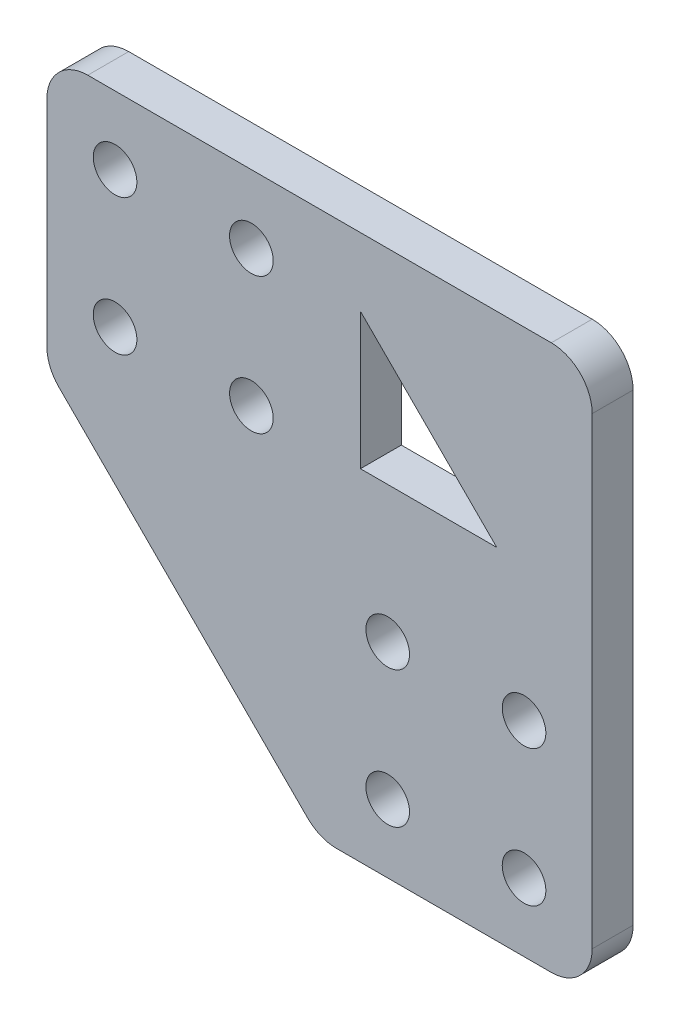
ISO-10303-21;
HEADER;
FILE_DESCRIPTION(('STEP AP214'),'2;1');
FILE_NAME('part.step','',(''),(''),'','','');
FILE_SCHEMA(('AUTOMOTIVE_DESIGN { 1 0 10303 214 1 1 1 1 }'));
ENDSEC;
DATA;
#1=APPLICATION_CONTEXT('core data for automotive mechanical design processes');
#2=APPLICATION_PROTOCOL_DEFINITION('international standard','automotive_design',2000,#1);
#3=PRODUCT_CONTEXT('',#1,'mechanical');
#4=PRODUCT('Part','Part','',(#3));
#5=PRODUCT_RELATED_PRODUCT_CATEGORY('part','',(#4));
#6=PRODUCT_DEFINITION_FORMATION('','',#4);
#7=PRODUCT_DEFINITION_CONTEXT('part definition',#1,'design');
#8=PRODUCT_DEFINITION('design','',#6,#7);
#9=PRODUCT_DEFINITION_SHAPE('','',#8);
#10=(LENGTH_UNIT() NAMED_UNIT(*) SI_UNIT(.MILLI.,.METRE.));
#11=(NAMED_UNIT(*) PLANE_ANGLE_UNIT() SI_UNIT($,.RADIAN.));
#12=(NAMED_UNIT(*) SI_UNIT($,.STERADIAN.) SOLID_ANGLE_UNIT());
#13=UNCERTAINTY_MEASURE_WITH_UNIT(LENGTH_MEASURE(1.E-05),#10,'distance_accuracy_value','');
#14=(GEOMETRIC_REPRESENTATION_CONTEXT(3) GLOBAL_UNCERTAINTY_ASSIGNED_CONTEXT((#13)) GLOBAL_UNIT_ASSIGNED_CONTEXT((#10,
#11,#12)) REPRESENTATION_CONTEXT('',''));
#15=CARTESIAN_POINT('',(0.,0.,0.));
#16=DIRECTION('',(0.,0.,1.));
#17=DIRECTION('',(1.,0.,0.));
#18=AXIS2_PLACEMENT_3D('',#15,#16,#17);
#19=CARTESIAN_POINT('',(0.,0.,3.));
#20=DIRECTION('',(0.,0.,-1.));
#21=DIRECTION('',(-1.,0.,0.));
#22=AXIS2_PLACEMENT_3D('',#19,#20,#21);
#23=PLANE('',#22);
#24=CARTESIAN_POINT('',(25.,-25.,3.));
#25=DIRECTION('',(0.,0.,1.));
#26=DIRECTION('',(-1.,0.,0.));
#27=AXIS2_PLACEMENT_3D('',#24,#25,#26);
#28=CIRCLE('',#27,1.6);
#29=CARTESIAN_POINT('',(23.4,-25.,3.));
#30=VERTEX_POINT('',#29);
#31=EDGE_CURVE('E182',#30,#30,#28,.T.);
#32=ORIENTED_EDGE('',*,*,#31,.F.);
#33=EDGE_LOOP('',(#32));
#34=FACE_BOUND('',#33,.T.);
#35=CARTESIAN_POINT('',(35.,-25.,3.));
#36=DIRECTION('',(0.,0.,1.));
#37=DIRECTION('',(1.,0.,0.));
#38=AXIS2_PLACEMENT_3D('',#35,#36,#37);
#39=CIRCLE('',#38,1.6);
#40=CARTESIAN_POINT('',(36.6,-25.,3.));
#41=VERTEX_POINT('',#40);
#42=EDGE_CURVE('E190',#41,#41,#39,.T.);
#43=ORIENTED_EDGE('',*,*,#42,.F.);
#44=EDGE_LOOP('',(#43));
#45=FACE_BOUND('',#44,.T.);
#46=CARTESIAN_POINT('',(35.,-35.,3.));
#47=DIRECTION('',(0.,0.,1.));
#48=DIRECTION('',(-1.,0.,0.));
#49=AXIS2_PLACEMENT_3D('',#46,#47,#48);
#50=CIRCLE('',#49,1.60000000000001);
#51=CARTESIAN_POINT('',(33.4,-35.,3.));
#52=VERTEX_POINT('',#51);
#53=EDGE_CURVE('E198',#52,#52,#50,.T.);
#54=ORIENTED_EDGE('',*,*,#53,.F.);
#55=EDGE_LOOP('',(#54));
#56=FACE_BOUND('',#55,.T.);
#57=CARTESIAN_POINT('',(25.,-35.,3.));
#58=DIRECTION('',(0.,0.,1.));
#59=DIRECTION('',(1.,0.,0.));
#60=AXIS2_PLACEMENT_3D('',#57,#58,#59);
#61=CIRCLE('',#60,1.6);
#62=CARTESIAN_POINT('',(26.6,-35.,3.));
#63=VERTEX_POINT('',#62);
#64=EDGE_CURVE('E206',#63,#63,#61,.T.);
#65=ORIENTED_EDGE('',*,*,#64,.F.);
#66=EDGE_LOOP('',(#65));
#67=FACE_BOUND('',#66,.T.);
#68=CARTESIAN_POINT('',(5.,-15.,3.));
#69=DIRECTION('',(0.,0.,1.));
#70=DIRECTION('',(-1.,0.,0.));
#71=AXIS2_PLACEMENT_3D('',#68,#69,#70);
#72=CIRCLE('',#71,1.6);
#73=CARTESIAN_POINT('',(3.4,-15.,3.));
#74=VERTEX_POINT('',#73);
#75=EDGE_CURVE('E214',#74,#74,#72,.T.);
#76=ORIENTED_EDGE('',*,*,#75,.F.);
#77=EDGE_LOOP('',(#76));
#78=FACE_BOUND('',#77,.T.);
#79=CARTESIAN_POINT('',(15.,-15.,3.));
#80=DIRECTION('',(0.,0.,1.));
#81=DIRECTION('',(1.,0.,0.));
#82=AXIS2_PLACEMENT_3D('',#79,#80,#81);
#83=CIRCLE('',#82,1.6);
#84=CARTESIAN_POINT('',(16.6,-15.,3.));
#85=VERTEX_POINT('',#84);
#86=EDGE_CURVE('E222',#85,#85,#83,.T.);
#87=ORIENTED_EDGE('',*,*,#86,.F.);
#88=EDGE_LOOP('',(#87));
#89=FACE_BOUND('',#88,.T.);
#90=CARTESIAN_POINT('',(15.,-5.,3.));
#91=DIRECTION('',(0.,0.,1.));
#92=DIRECTION('',(-1.,0.,0.));
#93=AXIS2_PLACEMENT_3D('',#90,#91,#92);
#94=CIRCLE('',#93,1.6);
#95=CARTESIAN_POINT('',(13.4,-5.,3.));
#96=VERTEX_POINT('',#95);
#97=EDGE_CURVE('E230',#96,#96,#94,.T.);
#98=ORIENTED_EDGE('',*,*,#97,.F.);
#99=EDGE_LOOP('',(#98));
#100=FACE_BOUND('',#99,.T.);
#101=CARTESIAN_POINT('',(5.,-5.,3.));
#102=DIRECTION('',(0.,0.,1.));
#103=DIRECTION('',(1.,0.,0.));
#104=AXIS2_PLACEMENT_3D('',#101,#102,#103);
#105=CIRCLE('',#104,1.6);
#106=CARTESIAN_POINT('',(6.6,-5.,3.));
#107=VERTEX_POINT('',#106);
#108=EDGE_CURVE('E238',#107,#107,#105,.T.);
#109=ORIENTED_EDGE('',*,*,#108,.F.);
#110=EDGE_LOOP('',(#109));
#111=FACE_BOUND('',#110,.T.);
#112=DIRECTION('',(0.707106781186548,-0.707106781186547,0.));
#113=VECTOR('',#112,1.);
#114=CARTESIAN_POINT('',(20.,-40.,3.));
#115=LINE('',#114,#113);
#116=CARTESIAN_POINT('',(0.878679656440361,-20.8786796564404,3.));
#117=VERTEX_POINT('',#116);
#118=CARTESIAN_POINT('',(19.1213203435596,-39.1213203435596,3.));
#119=VERTEX_POINT('',#118);
#120=EDGE_CURVE('E250',#117,#119,#115,.T.);
#121=ORIENTED_EDGE('',*,*,#120,.T.);
#122=CARTESIAN_POINT('',(21.2426406871193,-37.,3.));
#123=DIRECTION('',(0.,0.,-1.));
#124=DIRECTION('',(-1.,0.,0.));
#125=AXIS2_PLACEMENT_3D('',#122,#123,#124);
#126=CIRCLE('',#125,3.);
#127=CARTESIAN_POINT('',(21.2426406871193,-40.,3.));
#128=VERTEX_POINT('',#127);
#129=EDGE_CURVE('E322',#119,#128,#126,.F.);
#130=ORIENTED_EDGE('',*,*,#129,.T.);
#131=DIRECTION('',(1.,0.,0.));
#132=VECTOR('',#131,1.);
#133=CARTESIAN_POINT('',(40.,-40.,3.));
#134=LINE('',#133,#132);
#135=CARTESIAN_POINT('',(37.,-40.,3.));
#136=VERTEX_POINT('',#135);
#137=EDGE_CURVE('E255',#128,#136,#134,.T.);
#138=ORIENTED_EDGE('',*,*,#137,.T.);
#139=CARTESIAN_POINT('',(37.,-37.,3.));
#140=DIRECTION('',(0.,0.,-1.));
#141=DIRECTION('',(-1.,0.,0.));
#142=AXIS2_PLACEMENT_3D('',#139,#140,#141);
#143=CIRCLE('',#142,3.);
#144=CARTESIAN_POINT('',(40.,-37.,3.));
#145=VERTEX_POINT('',#144);
#146=EDGE_CURVE('E319',#136,#145,#143,.F.);
#147=ORIENTED_EDGE('',*,*,#146,.T.);
#148=DIRECTION('',(0.,1.,0.));
#149=VECTOR('',#148,1.);
#150=CARTESIAN_POINT('',(40.,0.,3.));
#151=LINE('',#150,#149);
#152=CARTESIAN_POINT('',(40.,-3.,3.));
#153=VERTEX_POINT('',#152);
#154=EDGE_CURVE('E259',#145,#153,#151,.T.);
#155=ORIENTED_EDGE('',*,*,#154,.T.);
#156=CARTESIAN_POINT('',(37.,-3.,3.));
#157=DIRECTION('',(0.,0.,-1.));
#158=DIRECTION('',(-1.,0.,0.));
#159=AXIS2_PLACEMENT_3D('',#156,#157,#158);
#160=CIRCLE('',#159,3.);
#161=CARTESIAN_POINT('',(37.,0.,3.));
#162=VERTEX_POINT('',#161);
#163=EDGE_CURVE('E66',#153,#162,#160,.F.);
#164=ORIENTED_EDGE('',*,*,#163,.T.);
#165=DIRECTION('',(-1.,0.,0.));
#166=VECTOR('',#165,1.);
#167=CARTESIAN_POINT('',(0.,0.,3.));
#168=LINE('',#167,#166);
#169=CARTESIAN_POINT('',(3.,0.,3.));
#170=VERTEX_POINT('',#169);
#171=EDGE_CURVE('E262',#162,#170,#168,.T.);
#172=ORIENTED_EDGE('',*,*,#171,.T.);
#173=CARTESIAN_POINT('',(3.,-3.,3.));
#174=DIRECTION('',(0.,0.,-1.));
#175=DIRECTION('',(-1.,0.,0.));
#176=AXIS2_PLACEMENT_3D('',#173,#174,#175);
#177=CIRCLE('',#176,3.);
#178=CARTESIAN_POINT('',(0.,-3.,3.));
#179=VERTEX_POINT('',#178);
#180=EDGE_CURVE('E311',#170,#179,#177,.F.);
#181=ORIENTED_EDGE('',*,*,#180,.T.);
#182=DIRECTION('',(0.,-1.,0.));
#183=VECTOR('',#182,1.);
#184=CARTESIAN_POINT('',(0.,-20.,3.));
#185=LINE('',#184,#183);
#186=CARTESIAN_POINT('',(0.,-18.7573593128807,3.));
#187=VERTEX_POINT('',#186);
#188=EDGE_CURVE('E246',#179,#187,#185,.T.);
#189=ORIENTED_EDGE('',*,*,#188,.T.);
#190=CARTESIAN_POINT('',(3.,-18.7573593128807,3.));
#191=DIRECTION('',(0.,0.,-1.));
#192=DIRECTION('',(-1.,0.,0.));
#193=AXIS2_PLACEMENT_3D('',#190,#191,#192);
#194=CIRCLE('',#193,3.);
#195=EDGE_CURVE('E314',#187,#117,#194,.F.);
#196=ORIENTED_EDGE('',*,*,#195,.T.);
#197=EDGE_LOOP('',(#121,#130,#138,#147,#155,#164,#172,#181,#189,#196));
#198=FACE_BOUND('',#197,.T.);
#199=DIRECTION('',(-0.707106781186548,0.707106781186547,0.));
#200=VECTOR('',#199,1.);
#201=CARTESIAN_POINT('',(33.,-15.,3.));
#202=LINE('',#201,#200);
#203=CARTESIAN_POINT('',(33.,-15.,3.));
#204=VERTEX_POINT('',#203);
#205=CARTESIAN_POINT('',(23.,-5.,3.));
#206=VERTEX_POINT('',#205);
#207=EDGE_CURVE('E141',#204,#206,#202,.T.);
#208=ORIENTED_EDGE('',*,*,#207,.F.);
#209=DIRECTION('',(1.,0.,0.));
#210=VECTOR('',#209,1.);
#211=CARTESIAN_POINT('',(23.,-15.,3.));
#212=LINE('',#211,#210);
#213=CARTESIAN_POINT('',(23.,-15.,3.));
#214=VERTEX_POINT('',#213);
#215=EDGE_CURVE('E164',#214,#204,#212,.T.);
#216=ORIENTED_EDGE('',*,*,#215,.F.);
#217=DIRECTION('',(0.,-1.,0.));
#218=VECTOR('',#217,1.);
#219=CARTESIAN_POINT('',(23.,-5.,3.));
#220=LINE('',#219,#218);
#221=EDGE_CURVE('E152',#206,#214,#220,.T.);
#222=ORIENTED_EDGE('',*,*,#221,.F.);
#223=EDGE_LOOP('',(#208,#216,#222));
#224=FACE_BOUND('',#223,.T.);
#225=ADVANCED_FACE('F43',(#34,#45,#56,#67,#78,#89,#100,#111,#198,#224),#23,.F.);
#226=CARTESIAN_POINT('',(0.,0.,0.));
#227=DIRECTION('',(0.,0.,-1.));
#228=DIRECTION('',(-1.,0.,0.));
#229=AXIS2_PLACEMENT_3D('',#226,#227,#228);
#230=PLANE('',#229);
#231=CARTESIAN_POINT('',(35.,-25.,0.));
#232=DIRECTION('',(0.,0.,1.));
#233=DIRECTION('',(1.,0.,0.));
#234=AXIS2_PLACEMENT_3D('',#231,#232,#233);
#235=CIRCLE('',#234,1.6);
#236=CARTESIAN_POINT('',(36.6,-25.,0.));
#237=VERTEX_POINT('',#236);
#238=EDGE_CURVE('E186',#237,#237,#235,.T.);
#239=ORIENTED_EDGE('',*,*,#238,.T.);
#240=EDGE_LOOP('',(#239));
#241=FACE_BOUND('',#240,.T.);
#242=CARTESIAN_POINT('',(25.,-35.,0.));
#243=DIRECTION('',(0.,0.,1.));
#244=DIRECTION('',(1.,0.,0.));
#245=AXIS2_PLACEMENT_3D('',#242,#243,#244);
#246=CIRCLE('',#245,1.6);
#247=CARTESIAN_POINT('',(26.6,-35.,0.));
#248=VERTEX_POINT('',#247);
#249=EDGE_CURVE('E202',#248,#248,#246,.T.);
#250=ORIENTED_EDGE('',*,*,#249,.T.);
#251=EDGE_LOOP('',(#250));
#252=FACE_BOUND('',#251,.T.);
#253=CARTESIAN_POINT('',(15.,-15.,0.));
#254=DIRECTION('',(0.,0.,1.));
#255=DIRECTION('',(1.,0.,0.));
#256=AXIS2_PLACEMENT_3D('',#253,#254,#255);
#257=CIRCLE('',#256,1.6);
#258=CARTESIAN_POINT('',(16.6,-15.,0.));
#259=VERTEX_POINT('',#258);
#260=EDGE_CURVE('E218',#259,#259,#257,.T.);
#261=ORIENTED_EDGE('',*,*,#260,.T.);
#262=EDGE_LOOP('',(#261));
#263=FACE_BOUND('',#262,.T.);
#264=CARTESIAN_POINT('',(5.,-5.,0.));
#265=DIRECTION('',(0.,0.,1.));
#266=DIRECTION('',(1.,0.,0.));
#267=AXIS2_PLACEMENT_3D('',#264,#265,#266);
#268=CIRCLE('',#267,1.6);
#269=CARTESIAN_POINT('',(6.6,-5.,0.));
#270=VERTEX_POINT('',#269);
#271=EDGE_CURVE('E234',#270,#270,#268,.T.);
#272=ORIENTED_EDGE('',*,*,#271,.T.);
#273=EDGE_LOOP('',(#272));
#274=FACE_BOUND('',#273,.T.);
#275=DIRECTION('',(1.,0.,0.));
#276=VECTOR('',#275,1.);
#277=CARTESIAN_POINT('',(40.,-40.,0.));
#278=LINE('',#277,#276);
#279=CARTESIAN_POINT('',(21.2426406871193,-40.,0.));
#280=VERTEX_POINT('',#279);
#281=CARTESIAN_POINT('',(37.,-40.,0.));
#282=VERTEX_POINT('',#281);
#283=EDGE_CURVE('E273',#280,#282,#278,.T.);
#284=ORIENTED_EDGE('',*,*,#283,.F.);
#285=CARTESIAN_POINT('',(21.2426406871193,-37.,0.));
#286=DIRECTION('',(0.,0.,-1.));
#287=DIRECTION('',(-1.,0.,0.));
#288=AXIS2_PLACEMENT_3D('',#285,#286,#287);
#289=CIRCLE('',#288,3.);
#290=CARTESIAN_POINT('',(19.1213203435596,-39.1213203435596,0.));
#291=VERTEX_POINT('',#290);
#292=EDGE_CURVE('E301',#280,#291,#289,.T.);
#293=ORIENTED_EDGE('',*,*,#292,.T.);
#294=DIRECTION('',(0.707106781186548,-0.707106781186547,0.));
#295=VECTOR('',#294,1.);
#296=CARTESIAN_POINT('',(20.,-40.,0.));
#297=LINE('',#296,#295);
#298=CARTESIAN_POINT('',(0.878679656440361,-20.8786796564404,0.));
#299=VERTEX_POINT('',#298);
#300=EDGE_CURVE('E269',#299,#291,#297,.T.);
#301=ORIENTED_EDGE('',*,*,#300,.F.);
#302=CARTESIAN_POINT('',(3.,-18.7573593128807,0.));
#303=DIRECTION('',(0.,0.,-1.));
#304=DIRECTION('',(-1.,0.,0.));
#305=AXIS2_PLACEMENT_3D('',#302,#303,#304);
#306=CIRCLE('',#305,3.);
#307=CARTESIAN_POINT('',(0.,-18.7573593128807,0.));
#308=VERTEX_POINT('',#307);
#309=EDGE_CURVE('E292',#299,#308,#306,.T.);
#310=ORIENTED_EDGE('',*,*,#309,.T.);
#311=DIRECTION('',(0.,-1.,0.));
#312=VECTOR('',#311,1.);
#313=CARTESIAN_POINT('',(0.,-20.,0.));
#314=LINE('',#313,#312);
#315=CARTESIAN_POINT('',(0.,-3.,0.));
#316=VERTEX_POINT('',#315);
#317=EDGE_CURVE('E242',#316,#308,#314,.T.);
#318=ORIENTED_EDGE('',*,*,#317,.F.);
#319=CARTESIAN_POINT('',(3.,-3.,0.));
#320=DIRECTION('',(0.,0.,-1.));
#321=DIRECTION('',(-1.,0.,0.));
#322=AXIS2_PLACEMENT_3D('',#319,#320,#321);
#323=CIRCLE('',#322,3.);
#324=CARTESIAN_POINT('',(3.,0.,0.));
#325=VERTEX_POINT('',#324);
#326=EDGE_CURVE('E289',#316,#325,#323,.T.);
#327=ORIENTED_EDGE('',*,*,#326,.T.);
#328=DIRECTION('',(-1.,0.,0.));
#329=VECTOR('',#328,1.);
#330=CARTESIAN_POINT('',(0.,0.,0.));
#331=LINE('',#330,#329);
#332=CARTESIAN_POINT('',(37.,0.,0.));
#333=VERTEX_POINT('',#332);
#334=EDGE_CURVE('E251',#333,#325,#331,.T.);
#335=ORIENTED_EDGE('',*,*,#334,.F.);
#336=CARTESIAN_POINT('',(37.,-3.,0.));
#337=DIRECTION('',(0.,0.,-1.));
#338=DIRECTION('',(-1.,0.,0.));
#339=AXIS2_PLACEMENT_3D('',#336,#337,#338);
#340=CIRCLE('',#339,3.);
#341=CARTESIAN_POINT('',(40.,-3.,0.));
#342=VERTEX_POINT('',#341);
#343=EDGE_CURVE('E295',#333,#342,#340,.T.);
#344=ORIENTED_EDGE('',*,*,#343,.T.);
#345=DIRECTION('',(0.,1.,0.));
#346=VECTOR('',#345,1.);
#347=CARTESIAN_POINT('',(40.,0.,0.));
#348=LINE('',#347,#346);
#349=CARTESIAN_POINT('',(40.,-37.,0.));
#350=VERTEX_POINT('',#349);
#351=EDGE_CURVE('E277',#350,#342,#348,.T.);
#352=ORIENTED_EDGE('',*,*,#351,.F.);
#353=CARTESIAN_POINT('',(37.,-37.,0.));
#354=DIRECTION('',(0.,0.,-1.));
#355=DIRECTION('',(-1.,0.,0.));
#356=AXIS2_PLACEMENT_3D('',#353,#354,#355);
#357=CIRCLE('',#356,3.);
#358=EDGE_CURVE('E298',#350,#282,#357,.T.);
#359=ORIENTED_EDGE('',*,*,#358,.T.);
#360=EDGE_LOOP('',(#284,#293,#301,#310,#318,#327,#335,#344,#352,#359));
#361=FACE_BOUND('',#360,.T.);
#362=CARTESIAN_POINT('',(15.,-5.,0.));
#363=DIRECTION('',(0.,0.,1.));
#364=DIRECTION('',(-1.,0.,0.));
#365=AXIS2_PLACEMENT_3D('',#362,#363,#364);
#366=CIRCLE('',#365,1.6);
#367=CARTESIAN_POINT('',(13.4,-5.,0.));
#368=VERTEX_POINT('',#367);
#369=EDGE_CURVE('E226',#368,#368,#366,.T.);
#370=ORIENTED_EDGE('',*,*,#369,.T.);
#371=EDGE_LOOP('',(#370));
#372=FACE_BOUND('',#371,.T.);
#373=CARTESIAN_POINT('',(5.,-15.,0.));
#374=DIRECTION('',(0.,0.,1.));
#375=DIRECTION('',(-1.,0.,0.));
#376=AXIS2_PLACEMENT_3D('',#373,#374,#375);
#377=CIRCLE('',#376,1.6);
#378=CARTESIAN_POINT('',(3.4,-15.,0.));
#379=VERTEX_POINT('',#378);
#380=EDGE_CURVE('E210',#379,#379,#377,.T.);
#381=ORIENTED_EDGE('',*,*,#380,.T.);
#382=EDGE_LOOP('',(#381));
#383=FACE_BOUND('',#382,.T.);
#384=CARTESIAN_POINT('',(35.,-35.,0.));
#385=DIRECTION('',(0.,0.,1.));
#386=DIRECTION('',(-1.,0.,0.));
#387=AXIS2_PLACEMENT_3D('',#384,#385,#386);
#388=CIRCLE('',#387,1.60000000000001);
#389=CARTESIAN_POINT('',(33.4,-35.,0.));
#390=VERTEX_POINT('',#389);
#391=EDGE_CURVE('E194',#390,#390,#388,.T.);
#392=ORIENTED_EDGE('',*,*,#391,.T.);
#393=EDGE_LOOP('',(#392));
#394=FACE_BOUND('',#393,.T.);
#395=CARTESIAN_POINT('',(25.,-25.,0.));
#396=DIRECTION('',(0.,0.,1.));
#397=DIRECTION('',(-1.,0.,0.));
#398=AXIS2_PLACEMENT_3D('',#395,#396,#397);
#399=CIRCLE('',#398,1.6);
#400=CARTESIAN_POINT('',(23.4,-25.,0.));
#401=VERTEX_POINT('',#400);
#402=EDGE_CURVE('E161',#401,#401,#399,.T.);
#403=ORIENTED_EDGE('',*,*,#402,.T.);
#404=EDGE_LOOP('',(#403));
#405=FACE_BOUND('',#404,.T.);
#406=DIRECTION('',(1.,0.,0.));
#407=VECTOR('',#406,1.);
#408=CARTESIAN_POINT('',(23.,-15.,0.));
#409=LINE('',#408,#407);
#410=CARTESIAN_POINT('',(23.,-15.,0.));
#411=VERTEX_POINT('',#410);
#412=CARTESIAN_POINT('',(33.,-15.,0.));
#413=VERTEX_POINT('',#412);
#414=EDGE_CURVE('E153',#411,#413,#409,.T.);
#415=ORIENTED_EDGE('',*,*,#414,.T.);
#416=DIRECTION('',(-0.707106781186548,0.707106781186547,0.));
#417=VECTOR('',#416,1.);
#418=CARTESIAN_POINT('',(33.,-15.,0.));
#419=LINE('',#418,#417);
#420=CARTESIAN_POINT('',(23.,-5.,0.));
#421=VERTEX_POINT('',#420);
#422=EDGE_CURVE('E170',#413,#421,#419,.T.);
#423=ORIENTED_EDGE('',*,*,#422,.T.);
#424=DIRECTION('',(0.,-1.,0.));
#425=VECTOR('',#424,1.);
#426=CARTESIAN_POINT('',(23.,-5.,0.));
#427=LINE('',#426,#425);
#428=EDGE_CURVE('E159',#421,#411,#427,.T.);
#429=ORIENTED_EDGE('',*,*,#428,.T.);
#430=EDGE_LOOP('',(#415,#423,#429));
#431=FACE_BOUND('',#430,.T.);
#432=ADVANCED_FACE('F349',(#241,#252,#263,#274,#361,#372,#383,#394,#405,#431),#230,.T.);
#433=CARTESIAN_POINT('',(0.,-20.,3.));
#434=DIRECTION('',(1.,0.,0.));
#435=DIRECTION('',(0.,0.,-1.));
#436=AXIS2_PLACEMENT_3D('',#433,#434,#435);
#437=PLANE('',#436);
#438=ORIENTED_EDGE('',*,*,#317,.T.);
#439=DIRECTION('',(0.,0.,-1.));
#440=VECTOR('',#439,1.);
#441=CARTESIAN_POINT('',(0.,-18.7573593128807,3.));
#442=LINE('',#441,#440);
#443=EDGE_CURVE('E11',#308,#187,#442,.F.);
#444=ORIENTED_EDGE('',*,*,#443,.T.);
#445=ORIENTED_EDGE('',*,*,#188,.F.);
#446=DIRECTION('',(0.,0.,-1.));
#447=VECTOR('',#446,1.);
#448=CARTESIAN_POINT('',(0.,-3.,3.));
#449=LINE('',#448,#447);
#450=EDGE_CURVE('E52',#179,#316,#449,.T.);
#451=ORIENTED_EDGE('',*,*,#450,.T.);
#452=EDGE_LOOP('',(#438,#444,#445,#451));
#453=FACE_BOUND('',#452,.T.);
#454=ADVANCED_FACE('F343',(#453),#437,.F.);
#455=CARTESIAN_POINT('',(20.,-40.,3.));
#456=DIRECTION('',(0.707106781186547,0.707106781186548,0.));
#457=DIRECTION('',(-0.707106781186548,0.707106781186547,0.));
#458=AXIS2_PLACEMENT_3D('',#455,#456,#457);
#459=PLANE('',#458);
#460=ORIENTED_EDGE('',*,*,#300,.T.);
#461=DIRECTION('',(0.,0.,-1.));
#462=VECTOR('',#461,1.);
#463=CARTESIAN_POINT('',(19.1213203435596,-39.1213203435596,3.));
#464=LINE('',#463,#462);
#465=EDGE_CURVE('E308',#291,#119,#464,.F.);
#466=ORIENTED_EDGE('',*,*,#465,.T.);
#467=ORIENTED_EDGE('',*,*,#120,.F.);
#468=DIRECTION('',(0.,0.,-1.));
#469=VECTOR('',#468,1.);
#470=CARTESIAN_POINT('',(0.878679656440361,-20.8786796564404,3.));
#471=LINE('',#470,#469);
#472=EDGE_CURVE('E304',#117,#299,#471,.T.);
#473=ORIENTED_EDGE('',*,*,#472,.T.);
#474=EDGE_LOOP('',(#460,#466,#467,#473));
#475=FACE_BOUND('',#474,.T.);
#476=ADVANCED_FACE('F359',(#475),#459,.F.);
#477=CARTESIAN_POINT('',(40.,-40.,3.));
#478=DIRECTION('',(0.,1.,0.));
#479=DIRECTION('',(0.,0.,1.));
#480=AXIS2_PLACEMENT_3D('',#477,#478,#479);
#481=PLANE('',#480);
#482=ORIENTED_EDGE('',*,*,#137,.F.);
#483=DIRECTION('',(0.,0.,-1.));
#484=VECTOR('',#483,1.);
#485=CARTESIAN_POINT('',(21.2426406871193,-40.,3.));
#486=LINE('',#485,#484);
#487=EDGE_CURVE('E285',#128,#280,#486,.T.);
#488=ORIENTED_EDGE('',*,*,#487,.T.);
#489=ORIENTED_EDGE('',*,*,#283,.T.);
#490=DIRECTION('',(0.,0.,-1.));
#491=VECTOR('',#490,1.);
#492=CARTESIAN_POINT('',(37.,-40.,3.));
#493=LINE('',#492,#491);
#494=EDGE_CURVE('E265',#282,#136,#493,.F.);
#495=ORIENTED_EDGE('',*,*,#494,.T.);
#496=EDGE_LOOP('',(#482,#488,#489,#495));
#497=FACE_BOUND('',#496,.T.);
#498=ADVANCED_FACE('F367',(#497),#481,.F.);
#499=CARTESIAN_POINT('',(40.,0.,3.));
#500=DIRECTION('',(-1.,0.,0.));
#501=DIRECTION('',(0.,-1.,0.));
#502=AXIS2_PLACEMENT_3D('',#499,#500,#501);
#503=PLANE('',#502);
#504=ORIENTED_EDGE('',*,*,#154,.F.);
#505=DIRECTION('',(0.,0.,-1.));
#506=VECTOR('',#505,1.);
#507=CARTESIAN_POINT('',(40.,-37.,3.));
#508=LINE('',#507,#506);
#509=EDGE_CURVE('E328',#145,#350,#508,.T.);
#510=ORIENTED_EDGE('',*,*,#509,.T.);
#511=ORIENTED_EDGE('',*,*,#351,.T.);
#512=DIRECTION('',(0.,0.,-1.));
#513=VECTOR('',#512,1.);
#514=CARTESIAN_POINT('',(40.,-3.,3.));
#515=LINE('',#514,#513);
#516=EDGE_CURVE('E325',#342,#153,#515,.F.);
#517=ORIENTED_EDGE('',*,*,#516,.T.);
#518=EDGE_LOOP('',(#504,#510,#511,#517));
#519=FACE_BOUND('',#518,.T.);
#520=ADVANCED_FACE('F376',(#519),#503,.F.);
#521=CARTESIAN_POINT('',(0.,0.,3.));
#522=DIRECTION('',(0.,-1.,0.));
#523=DIRECTION('',(0.,0.,-1.));
#524=AXIS2_PLACEMENT_3D('',#521,#522,#523);
#525=PLANE('',#524);
#526=ORIENTED_EDGE('',*,*,#171,.F.);
#527=DIRECTION('',(0.,0.,-1.));
#528=VECTOR('',#527,1.);
#529=CARTESIAN_POINT('',(37.,0.,3.));
#530=LINE('',#529,#528);
#531=EDGE_CURVE('E334',#162,#333,#530,.T.);
#532=ORIENTED_EDGE('',*,*,#531,.T.);
#533=ORIENTED_EDGE('',*,*,#334,.T.);
#534=DIRECTION('',(0.,0.,-1.));
#535=VECTOR('',#534,1.);
#536=CARTESIAN_POINT('',(3.,0.,3.));
#537=LINE('',#536,#535);
#538=EDGE_CURVE('E59',#325,#170,#537,.F.);
#539=ORIENTED_EDGE('',*,*,#538,.T.);
#540=EDGE_LOOP('',(#526,#532,#533,#539));
#541=FACE_BOUND('',#540,.T.);
#542=ADVANCED_FACE('F381',(#541),#525,.F.);
#543=CARTESIAN_POINT('',(5.,-5.,3.));
#544=DIRECTION('',(0.,0.,-1.));
#545=DIRECTION('',(-1.,0.,0.));
#546=AXIS2_PLACEMENT_3D('',#543,#544,#545);
#547=CYLINDRICAL_SURFACE('',#546,1.6);
#548=ORIENTED_EDGE('',*,*,#108,.T.);
#549=EDGE_LOOP('',(#548));
#550=FACE_BOUND('',#549,.T.);
#551=ORIENTED_EDGE('',*,*,#271,.F.);
#552=EDGE_LOOP('',(#551));
#553=FACE_BOUND('',#552,.T.);
#554=ADVANCED_FACE('F397',(#550,#553),#547,.F.);
#555=CARTESIAN_POINT('',(15.,-5.,3.));
#556=DIRECTION('',(0.,0.,-1.));
#557=DIRECTION('',(-1.,0.,0.));
#558=AXIS2_PLACEMENT_3D('',#555,#556,#557);
#559=CYLINDRICAL_SURFACE('',#558,1.6);
#560=ORIENTED_EDGE('',*,*,#97,.T.);
#561=EDGE_LOOP('',(#560));
#562=FACE_BOUND('',#561,.T.);
#563=ORIENTED_EDGE('',*,*,#369,.F.);
#564=EDGE_LOOP('',(#563));
#565=FACE_BOUND('',#564,.T.);
#566=ADVANCED_FACE('F532',(#562,#565),#559,.F.);
#567=CARTESIAN_POINT('',(15.,-15.,3.));
#568=DIRECTION('',(0.,0.,-1.));
#569=DIRECTION('',(-1.,0.,0.));
#570=AXIS2_PLACEMENT_3D('',#567,#568,#569);
#571=CYLINDRICAL_SURFACE('',#570,1.6);
#572=ORIENTED_EDGE('',*,*,#86,.T.);
#573=EDGE_LOOP('',(#572));
#574=FACE_BOUND('',#573,.T.);
#575=ORIENTED_EDGE('',*,*,#260,.F.);
#576=EDGE_LOOP('',(#575));
#577=FACE_BOUND('',#576,.T.);
#578=ADVANCED_FACE('F522',(#574,#577),#571,.F.);
#579=CARTESIAN_POINT('',(5.,-15.,3.));
#580=DIRECTION('',(0.,0.,-1.));
#581=DIRECTION('',(-1.,0.,0.));
#582=AXIS2_PLACEMENT_3D('',#579,#580,#581);
#583=CYLINDRICAL_SURFACE('',#582,1.6);
#584=ORIENTED_EDGE('',*,*,#75,.T.);
#585=EDGE_LOOP('',(#584));
#586=FACE_BOUND('',#585,.T.);
#587=ORIENTED_EDGE('',*,*,#380,.F.);
#588=EDGE_LOOP('',(#587));
#589=FACE_BOUND('',#588,.T.);
#590=ADVANCED_FACE('F512',(#586,#589),#583,.F.);
#591=CARTESIAN_POINT('',(25.,-35.,3.));
#592=DIRECTION('',(0.,0.,-1.));
#593=DIRECTION('',(-1.,0.,0.));
#594=AXIS2_PLACEMENT_3D('',#591,#592,#593);
#595=CYLINDRICAL_SURFACE('',#594,1.6);
#596=ORIENTED_EDGE('',*,*,#64,.T.);
#597=EDGE_LOOP('',(#596));
#598=FACE_BOUND('',#597,.T.);
#599=ORIENTED_EDGE('',*,*,#249,.F.);
#600=EDGE_LOOP('',(#599));
#601=FACE_BOUND('',#600,.T.);
#602=ADVANCED_FACE('F502',(#598,#601),#595,.F.);
#603=CARTESIAN_POINT('',(35.,-35.,3.));
#604=DIRECTION('',(0.,0.,-1.));
#605=DIRECTION('',(-1.,0.,0.));
#606=AXIS2_PLACEMENT_3D('',#603,#604,#605);
#607=CYLINDRICAL_SURFACE('',#606,1.60000000000001);
#608=ORIENTED_EDGE('',*,*,#53,.T.);
#609=EDGE_LOOP('',(#608));
#610=FACE_BOUND('',#609,.T.);
#611=ORIENTED_EDGE('',*,*,#391,.F.);
#612=EDGE_LOOP('',(#611));
#613=FACE_BOUND('',#612,.T.);
#614=ADVANCED_FACE('F492',(#610,#613),#607,.F.);
#615=CARTESIAN_POINT('',(35.,-25.,3.));
#616=DIRECTION('',(0.,0.,-1.));
#617=DIRECTION('',(-1.,0.,0.));
#618=AXIS2_PLACEMENT_3D('',#615,#616,#617);
#619=CYLINDRICAL_SURFACE('',#618,1.6);
#620=ORIENTED_EDGE('',*,*,#42,.T.);
#621=EDGE_LOOP('',(#620));
#622=FACE_BOUND('',#621,.T.);
#623=ORIENTED_EDGE('',*,*,#238,.F.);
#624=EDGE_LOOP('',(#623));
#625=FACE_BOUND('',#624,.T.);
#626=ADVANCED_FACE('F482',(#622,#625),#619,.F.);
#627=CARTESIAN_POINT('',(25.,-25.,3.));
#628=DIRECTION('',(0.,0.,-1.));
#629=DIRECTION('',(-1.,0.,0.));
#630=AXIS2_PLACEMENT_3D('',#627,#628,#629);
#631=CYLINDRICAL_SURFACE('',#630,1.6);
#632=ORIENTED_EDGE('',*,*,#31,.T.);
#633=EDGE_LOOP('',(#632));
#634=FACE_BOUND('',#633,.T.);
#635=ORIENTED_EDGE('',*,*,#402,.F.);
#636=EDGE_LOOP('',(#635));
#637=FACE_BOUND('',#636,.T.);
#638=ADVANCED_FACE('F473',(#634,#637),#631,.F.);
#639=CARTESIAN_POINT('',(33.,-15.,3.));
#640=DIRECTION('',(-0.707106781186547,-0.707106781186548,0.));
#641=DIRECTION('',(0.707106781186548,-0.707106781186547,0.));
#642=AXIS2_PLACEMENT_3D('',#639,#640,#641);
#643=PLANE('',#642);
#644=ORIENTED_EDGE('',*,*,#422,.F.);
#645=DIRECTION('',(0.,0.,-1.));
#646=VECTOR('',#645,1.);
#647=CARTESIAN_POINT('',(33.,-15.,3.));
#648=LINE('',#647,#646);
#649=EDGE_CURVE('E147',#204,#413,#648,.T.);
#650=ORIENTED_EDGE('',*,*,#649,.F.);
#651=ORIENTED_EDGE('',*,*,#207,.T.);
#652=DIRECTION('',(0.,0.,-1.));
#653=VECTOR('',#652,1.);
#654=CARTESIAN_POINT('',(23.,-5.,3.));
#655=LINE('',#654,#653);
#656=EDGE_CURVE('E144',#206,#421,#655,.T.);
#657=ORIENTED_EDGE('',*,*,#656,.T.);
#658=EDGE_LOOP('',(#644,#650,#651,#657));
#659=FACE_BOUND('',#658,.T.);
#660=ADVANCED_FACE('F143',(#659),#643,.T.);
#661=CARTESIAN_POINT('',(23.,-5.,3.));
#662=DIRECTION('',(1.,0.,0.));
#663=DIRECTION('',(0.,0.,-1.));
#664=AXIS2_PLACEMENT_3D('',#661,#662,#663);
#665=PLANE('',#664);
#666=ORIENTED_EDGE('',*,*,#428,.F.);
#667=ORIENTED_EDGE('',*,*,#656,.F.);
#668=ORIENTED_EDGE('',*,*,#221,.T.);
#669=DIRECTION('',(0.,0.,-1.));
#670=VECTOR('',#669,1.);
#671=CARTESIAN_POINT('',(23.,-15.,3.));
#672=LINE('',#671,#670);
#673=EDGE_CURVE('E162',#214,#411,#672,.T.);
#674=ORIENTED_EDGE('',*,*,#673,.T.);
#675=EDGE_LOOP('',(#666,#667,#668,#674));
#676=FACE_BOUND('',#675,.T.);
#677=ADVANCED_FACE('F157',(#676),#665,.T.);
#678=CARTESIAN_POINT('',(23.,-15.,3.));
#679=DIRECTION('',(0.,1.,0.));
#680=DIRECTION('',(0.,0.,1.));
#681=AXIS2_PLACEMENT_3D('',#678,#679,#680);
#682=PLANE('',#681);
#683=ORIENTED_EDGE('',*,*,#414,.F.);
#684=ORIENTED_EDGE('',*,*,#673,.F.);
#685=ORIENTED_EDGE('',*,*,#215,.T.);
#686=ORIENTED_EDGE('',*,*,#649,.T.);
#687=EDGE_LOOP('',(#683,#684,#685,#686));
#688=FACE_BOUND('',#687,.T.);
#689=ADVANCED_FACE('F412',(#688),#682,.T.);
#690=CARTESIAN_POINT('',(21.2426406871193,-37.,3.));
#691=DIRECTION('',(0.,0.,-1.));
#692=DIRECTION('',(-1.,0.,0.));
#693=AXIS2_PLACEMENT_3D('',#690,#691,#692);
#694=CYLINDRICAL_SURFACE('',#693,3.);
#695=ORIENTED_EDGE('',*,*,#129,.F.);
#696=ORIENTED_EDGE('',*,*,#465,.F.);
#697=ORIENTED_EDGE('',*,*,#292,.F.);
#698=ORIENTED_EDGE('',*,*,#487,.F.);
#699=EDGE_LOOP('',(#695,#696,#697,#698));
#700=FACE_BOUND('',#699,.T.);
#701=ADVANCED_FACE('F365',(#700),#694,.T.);
#702=CARTESIAN_POINT('',(37.,-37.,3.));
#703=DIRECTION('',(0.,0.,-1.));
#704=DIRECTION('',(-1.,0.,0.));
#705=AXIS2_PLACEMENT_3D('',#702,#703,#704);
#706=CYLINDRICAL_SURFACE('',#705,3.);
#707=ORIENTED_EDGE('',*,*,#146,.F.);
#708=ORIENTED_EDGE('',*,*,#494,.F.);
#709=ORIENTED_EDGE('',*,*,#358,.F.);
#710=ORIENTED_EDGE('',*,*,#509,.F.);
#711=EDGE_LOOP('',(#707,#708,#709,#710));
#712=FACE_BOUND('',#711,.T.);
#713=ADVANCED_FACE('F373',(#712),#706,.T.);
#714=CARTESIAN_POINT('',(37.,-3.,3.));
#715=DIRECTION('',(0.,0.,-1.));
#716=DIRECTION('',(-1.,0.,0.));
#717=AXIS2_PLACEMENT_3D('',#714,#715,#716);
#718=CYLINDRICAL_SURFACE('',#717,3.);
#719=ORIENTED_EDGE('',*,*,#163,.F.);
#720=ORIENTED_EDGE('',*,*,#516,.F.);
#721=ORIENTED_EDGE('',*,*,#343,.F.);
#722=ORIENTED_EDGE('',*,*,#531,.F.);
#723=EDGE_LOOP('',(#719,#720,#721,#722));
#724=FACE_BOUND('',#723,.T.);
#725=ADVANCED_FACE('F380',(#724),#718,.T.);
#726=CARTESIAN_POINT('',(3.,-18.7573593128807,3.));
#727=DIRECTION('',(0.,0.,-1.));
#728=DIRECTION('',(-1.,0.,0.));
#729=AXIS2_PLACEMENT_3D('',#726,#727,#728);
#730=CYLINDRICAL_SURFACE('',#729,3.);
#731=ORIENTED_EDGE('',*,*,#195,.F.);
#732=ORIENTED_EDGE('',*,*,#443,.F.);
#733=ORIENTED_EDGE('',*,*,#309,.F.);
#734=ORIENTED_EDGE('',*,*,#472,.F.);
#735=EDGE_LOOP('',(#731,#732,#733,#734));
#736=FACE_BOUND('',#735,.T.);
#737=ADVANCED_FACE('F356',(#736),#730,.T.);
#738=CARTESIAN_POINT('',(3.,-3.,3.));
#739=DIRECTION('',(0.,0.,-1.));
#740=DIRECTION('',(-1.,0.,0.));
#741=AXIS2_PLACEMENT_3D('',#738,#739,#740);
#742=CYLINDRICAL_SURFACE('',#741,3.);
#743=ORIENTED_EDGE('',*,*,#180,.F.);
#744=ORIENTED_EDGE('',*,*,#538,.F.);
#745=ORIENTED_EDGE('',*,*,#326,.F.);
#746=ORIENTED_EDGE('',*,*,#450,.F.);
#747=EDGE_LOOP('',(#743,#744,#745,#746));
#748=FACE_BOUND('',#747,.T.);
#749=ADVANCED_FACE('F45',(#748),#742,.T.);
#750=CLOSED_SHELL('',(#225,#432,#454,#476,#498,#520,#542,#554,#566,#578,#590,#602,#614,#626,
#638,#660,#677,#689,#701,#713,#725,#737,#749));
#751=MANIFOLD_SOLID_BREP('B2',#750);
#752=ADVANCED_BREP_SHAPE_REPRESENTATION('',(#18,#751),#14);
#753=SHAPE_DEFINITION_REPRESENTATION(#9,#752);
ENDSEC;
END-ISO-10303-21;
